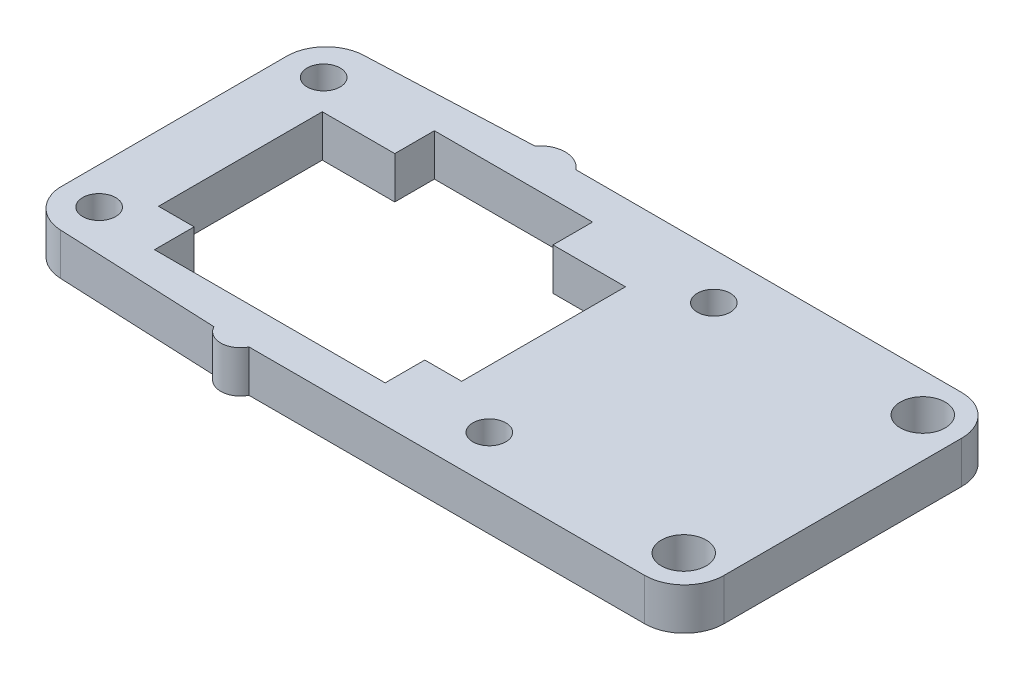
ISO-10303-21;
HEADER;
FILE_DESCRIPTION(('STEP AP214'),'2;1');
FILE_NAME('part.step','',(''),(''),'','','');
FILE_SCHEMA(('AUTOMOTIVE_DESIGN { 1 0 10303 214 1 1 1 1 }'));
ENDSEC;
DATA;
#1=APPLICATION_CONTEXT('core data for automotive mechanical design processes');
#2=APPLICATION_PROTOCOL_DEFINITION('international standard','automotive_design',2000,#1);
#3=PRODUCT_CONTEXT('',#1,'mechanical');
#4=PRODUCT('Part','Part','',(#3));
#5=PRODUCT_RELATED_PRODUCT_CATEGORY('part','',(#4));
#6=PRODUCT_DEFINITION_FORMATION('','',#4);
#7=PRODUCT_DEFINITION_CONTEXT('part definition',#1,'design');
#8=PRODUCT_DEFINITION('design','',#6,#7);
#9=PRODUCT_DEFINITION_SHAPE('','',#8);
#10=(LENGTH_UNIT() NAMED_UNIT(*) SI_UNIT(.MILLI.,.METRE.));
#11=(NAMED_UNIT(*) PLANE_ANGLE_UNIT() SI_UNIT($,.RADIAN.));
#12=(NAMED_UNIT(*) SI_UNIT($,.STERADIAN.) SOLID_ANGLE_UNIT());
#13=UNCERTAINTY_MEASURE_WITH_UNIT(LENGTH_MEASURE(1.E-05),#10,'distance_accuracy_value','');
#14=(GEOMETRIC_REPRESENTATION_CONTEXT(3) GLOBAL_UNCERTAINTY_ASSIGNED_CONTEXT((#13)) GLOBAL_UNIT_ASSIGNED_CONTEXT((#10,
#11,#12)) REPRESENTATION_CONTEXT('',''));
#15=CARTESIAN_POINT('',(0.,0.,0.));
#16=DIRECTION('',(0.,0.,1.));
#17=DIRECTION('',(1.,0.,0.));
#18=AXIS2_PLACEMENT_3D('',#15,#16,#17);
#19=CARTESIAN_POINT('',(3.3843469748906,3.175,1.98427823473681));
#20=DIRECTION('',(0.,1.,0.));
#21=DIRECTION('',(0.,0.,1.));
#22=AXIS2_PLACEMENT_3D('',#19,#20,#21);
#23=PLANE('',#22);
#24=CARTESIAN_POINT('',(34.685233075441,3.175,-0.289707036284531));
#25=DIRECTION('',(0.,1.,0.));
#26=DIRECTION('',(0.,0.,1.));
#27=AXIS2_PLACEMENT_3D('',#24,#25,#26);
#28=CIRCLE('',#27,1.7);
#29=CARTESIAN_POINT('',(34.685233075441,3.175,1.41029296371547));
#30=VERTEX_POINT('',#29);
#31=EDGE_CURVE('E290',#30,#30,#28,.T.);
#32=ORIENTED_EDGE('',*,*,#31,.F.);
#33=EDGE_LOOP('',(#32));
#34=FACE_BOUND('',#33,.T.);
#35=CARTESIAN_POINT('',(19.4122280798133,3.175,-0.839632763997289));
#36=DIRECTION('',(0.,1.,0.));
#37=DIRECTION('',(0.,0.,1.));
#38=AXIS2_PLACEMENT_3D('',#35,#36,#37);
#39=CIRCLE('',#38,1.25);
#40=CARTESIAN_POINT('',(19.4122280798133,3.175,0.410367236002712));
#41=VERTEX_POINT('',#40);
#42=EDGE_CURVE('E302',#41,#41,#39,.T.);
#43=ORIENTED_EDGE('',*,*,#42,.F.);
#44=EDGE_LOOP('',(#43));
#45=FACE_BOUND('',#44,.T.);
#46=CARTESIAN_POINT('',(-10.1352653795593,3.175,-17.8402616182965));
#47=DIRECTION('',(0.,1.,0.));
#48=DIRECTION('',(0.,0.,1.));
#49=AXIS2_PLACEMENT_3D('',#46,#47,#48);
#50=CIRCLE('',#49,1.25);
#51=CARTESIAN_POINT('',(-10.1352653795593,3.175,-16.5902616182965));
#52=VERTEX_POINT('',#51);
#53=EDGE_CURVE('E314',#52,#52,#50,.T.);
#54=ORIENTED_EDGE('',*,*,#53,.F.);
#55=EDGE_LOOP('',(#54));
#56=FACE_BOUND('',#55,.T.);
#57=CARTESIAN_POINT('',(3.3843469748906,3.175,1.98427823473681));
#58=DIRECTION('',(0.,1.,0.));
#59=DIRECTION('',(0.,0.,1.));
#60=AXIS2_PLACEMENT_3D('',#57,#58,#59);
#61=CIRCLE('',#60,1.48732922636627);
#62=CARTESIAN_POINT('',(2.05948744306417,3.175,2.66021865262284));
#63=VERTEX_POINT('',#62);
#64=CARTESIAN_POINT('',(4.70920650665646,3.175,2.66021865274156));
#65=VERTEX_POINT('',#64);
#66=EDGE_CURVE('E320',#63,#65,#61,.T.);
#67=ORIENTED_EDGE('',*,*,#66,.T.);
#68=DIRECTION('',(1.,0.,0.));
#69=VECTOR('',#68,1.);
#70=CARTESIAN_POINT('',(4.70920650665646,3.175,2.66021865274156));
#71=LINE('',#70,#69);
#72=CARTESIAN_POINT('',(34.6801643499563,3.175,2.66021865274156));
#73=VERTEX_POINT('',#72);
#74=EDGE_CURVE('E323',#65,#73,#71,.T.);
#75=ORIENTED_EDGE('',*,*,#74,.T.);
#76=CARTESIAN_POINT('',(34.6801643499563,3.175,-0.339670995738072));
#77=DIRECTION('',(0.,1.,0.));
#78=DIRECTION('',(0.,0.,-1.));
#79=AXIS2_PLACEMENT_3D('',#76,#77,#78);
#80=CIRCLE('',#79,2.99988964847963);
#81=CARTESIAN_POINT('',(37.6800539984359,3.175,-0.339670995738072));
#82=VERTEX_POINT('',#81);
#83=EDGE_CURVE('E326',#73,#82,#80,.T.);
#84=ORIENTED_EDGE('',*,*,#83,.T.);
#85=DIRECTION('',(0.,0.,-1.));
#86=VECTOR('',#85,1.);
#87=CARTESIAN_POINT('',(37.6800539984359,3.175,-0.339670995738072));
#88=LINE('',#87,#86);
#89=CARTESIAN_POINT('',(37.680053998436,3.175,-18.34569235233));
#90=VERTEX_POINT('',#89);
#91=EDGE_CURVE('E328',#82,#90,#88,.T.);
#92=ORIENTED_EDGE('',*,*,#91,.T.);
#93=CARTESIAN_POINT('',(34.6853305618331,3.175,-18.34569235233));
#94=DIRECTION('',(0.,1.,0.));
#95=DIRECTION('',(0.,0.,-1.));
#96=AXIS2_PLACEMENT_3D('',#93,#94,#95);
#97=CIRCLE('',#96,2.99472343660281);
#98=CARTESIAN_POINT('',(34.6853305619677,3.175,-21.3404157889328));
#99=VERTEX_POINT('',#98);
#100=EDGE_CURVE('E330',#90,#99,#97,.T.);
#101=ORIENTED_EDGE('',*,*,#100,.T.);
#102=CARTESIAN_POINT('',(34.6853305619677,3.175,-21.3404157889328));
#103=CARTESIAN_POINT('',(13.555998875761,3.175,-21.3404157898819));
#104=CARTESIAN_POINT('',(5.4575364050089,3.175,-21.3404157902483));
#105=B_SPLINE_CURVE_WITH_KNOTS('',2,(#102,#103,#104),.UNSPECIFIED.,.F.,.F.,(3,3),(8.,9.),.UNSPECIFIED.);
#106=CARTESIAN_POINT('',(5.4575364050089,3.175,-21.3404157902483));
#107=VERTEX_POINT('',#106);
#108=EDGE_CURVE('E332',#99,#107,#105,.T.);
#109=ORIENTED_EDGE('',*,*,#108,.T.);
#110=CARTESIAN_POINT('',(3.90376420784908,3.175,-20.1507548931228));
#111=DIRECTION('',(0.,1.,0.));
#112=DIRECTION('',(0.,0.,-1.));
#113=AXIS2_PLACEMENT_3D('',#110,#111,#112);
#114=CIRCLE('',#113,1.9569111095848);
#115=CARTESIAN_POINT('',(2.34999201079589,3.175,-21.3404157903876));
#116=VERTEX_POINT('',#115);
#117=EDGE_CURVE('E336',#107,#116,#114,.T.);
#118=ORIENTED_EDGE('',*,*,#117,.T.);
#119=DIRECTION('',(-0.999086011528336,0.,0.042745076539896));
#120=VECTOR('',#119,1.);
#121=CARTESIAN_POINT('',(2.34999201079589,3.175,-21.3404157903876));
#122=LINE('',#121,#120);
#123=CARTESIAN_POINT('',(-10.0922641329791,3.175,-20.8080840541229));
#124=VERTEX_POINT('',#123);
#125=EDGE_CURVE('E341',#116,#124,#122,.T.);
#126=ORIENTED_EDGE('',*,*,#125,.T.);
#127=CARTESIAN_POINT('',(-9.96553344927198,3.175,-17.8459919590245));
#128=DIRECTION('',(0.,1.,0.));
#129=DIRECTION('',(0.,0.,1.));
#130=AXIS2_PLACEMENT_3D('',#127,#128,#129);
#131=CIRCLE('',#130,2.96480188984644);
#132=CARTESIAN_POINT('',(-12.9301416772525,3.175,-17.8121053742605));
#133=VERTEX_POINT('',#132);
#134=EDGE_CURVE('E343',#124,#133,#131,.T.);
#135=ORIENTED_EDGE('',*,*,#134,.T.);
#136=DIRECTION('',(0.000812173040055136,0.,0.999999670187422));
#137=VECTOR('',#136,1.);
#138=CARTESIAN_POINT('',(-12.9301416772525,3.175,-17.8121053742605));
#139=LINE('',#138,#137);
#140=CARTESIAN_POINT('',(-12.916142632479,3.175,-0.575581301078846));
#141=VERTEX_POINT('',#140);
#142=EDGE_CURVE('E345',#133,#141,#139,.T.);
#143=ORIENTED_EDGE('',*,*,#142,.T.);
#144=CARTESIAN_POINT('',(-9.9625237252895,3.175,-0.834106409775795));
#145=DIRECTION('',(0.,1.,0.));
#146=DIRECTION('',(0.,0.,-1.));
#147=AXIS2_PLACEMENT_3D('',#144,#145,#146);
#148=CIRCLE('',#147,2.96491144568163);
#149=CARTESIAN_POINT('',(-10.0922641340075,3.175,2.12796504565529));
#150=VERTEX_POINT('',#149);
#151=EDGE_CURVE('E347',#141,#150,#148,.T.);
#152=ORIENTED_EDGE('',*,*,#151,.T.);
#153=DIRECTION('',(0.999042133196024,0.,0.0437586117140054));
#154=VECTOR('',#153,1.);
#155=CARTESIAN_POINT('',(-10.0922641340075,3.175,2.12796504565529));
#156=LINE('',#155,#154);
#157=EDGE_CURVE('E349',#150,#63,#156,.T.);
#158=ORIENTED_EDGE('',*,*,#157,.T.);
#159=EDGE_LOOP('',(#67,#75,#84,#92,#101,#109,#118,#126,#135,#143,#152,#158));
#160=FACE_BOUND('',#159,.T.);
#161=CARTESIAN_POINT('',(-10.1352653803214,3.175,-0.839730428389404));
#162=DIRECTION('',(0.,1.,0.));
#163=DIRECTION('',(0.,0.,1.));
#164=AXIS2_PLACEMENT_3D('',#161,#162,#163);
#165=CIRCLE('',#164,1.25);
#166=CARTESIAN_POINT('',(-10.1352653803214,3.175,0.410269571610595));
#167=VERTEX_POINT('',#166);
#168=EDGE_CURVE('E308',#167,#167,#165,.T.);
#169=ORIENTED_EDGE('',*,*,#168,.F.);
#170=EDGE_LOOP('',(#169));
#171=FACE_BOUND('',#170,.T.);
#172=CARTESIAN_POINT('',(19.4122280805773,3.175,-17.8401688370541));
#173=DIRECTION('',(0.,1.,0.));
#174=DIRECTION('',(0.,0.,1.));
#175=AXIS2_PLACEMENT_3D('',#172,#173,#174);
#176=CIRCLE('',#175,1.25);
#177=CARTESIAN_POINT('',(19.4122280805773,3.175,-16.5901688370541));
#178=VERTEX_POINT('',#177);
#179=EDGE_CURVE('E296',#178,#178,#176,.T.);
#180=ORIENTED_EDGE('',*,*,#179,.F.);
#181=EDGE_LOOP('',(#180));
#182=FACE_BOUND('',#181,.T.);
#183=CARTESIAN_POINT('',(34.6852647593301,3.175,-18.390319188368));
#184=DIRECTION('',(0.,1.,0.));
#185=DIRECTION('',(0.,0.,1.));
#186=AXIS2_PLACEMENT_3D('',#183,#184,#185);
#187=CIRCLE('',#186,1.7);
#188=CARTESIAN_POINT('',(34.6852647593301,3.175,-16.690319188368));
#189=VERTEX_POINT('',#188);
#190=EDGE_CURVE('E284',#189,#189,#187,.T.);
#191=ORIENTED_EDGE('',*,*,#190,.F.);
#192=EDGE_LOOP('',(#191));
#193=FACE_BOUND('',#192,.T.);
#194=DIRECTION('',(-1.,0.,0.));
#195=VECTOR('',#194,1.);
#196=CARTESIAN_POINT('',(9.53011806784337,3.175,-15.540268571059));
#197=LINE('',#196,#195);
#198=CARTESIAN_POINT('',(15.0202005785099,3.175,-15.540268571059));
#199=VERTEX_POINT('',#198);
#200=CARTESIAN_POINT('',(9.53011806784337,3.175,-15.540268571059));
#201=VERTEX_POINT('',#200);
#202=EDGE_CURVE('E210',#199,#201,#197,.T.);
#203=ORIENTED_EDGE('',*,*,#202,.F.);
#204=DIRECTION('',(0.,0.,-1.));
#205=VECTOR('',#204,1.);
#206=CARTESIAN_POINT('',(15.0202005785099,3.175,-15.540268571059));
#207=LINE('',#206,#205);
#208=CARTESIAN_POINT('',(15.0202005785099,3.175,-3.13986020351678));
#209=VERTEX_POINT('',#208);
#210=EDGE_CURVE('E196',#209,#199,#207,.T.);
#211=ORIENTED_EDGE('',*,*,#210,.F.);
#212=DIRECTION('',(1.,0.,0.));
#213=VECTOR('',#212,1.);
#214=CARTESIAN_POINT('',(15.0202005785099,3.175,-3.13986020351678));
#215=LINE('',#214,#213);
#216=CARTESIAN_POINT('',(12.2250708162067,3.175,-3.13986020351678));
#217=VERTEX_POINT('',#216);
#218=EDGE_CURVE('E191',#217,#209,#215,.T.);
#219=ORIENTED_EDGE('',*,*,#218,.F.);
#220=DIRECTION('',(0.,0.,-1.));
#221=VECTOR('',#220,1.);
#222=CARTESIAN_POINT('',(12.2250708162067,3.175,-3.13986020351678));
#223=LINE('',#222,#221);
#224=CARTESIAN_POINT('',(12.2250708162067,3.175,-0.13977967735232));
#225=VERTEX_POINT('',#224);
#226=EDGE_CURVE('E230',#225,#217,#223,.T.);
#227=ORIENTED_EDGE('',*,*,#226,.F.);
#228=DIRECTION('',(1.,0.,0.));
#229=VECTOR('',#228,1.);
#230=CARTESIAN_POINT('',(12.2250708162067,3.175,-0.13977967735232));
#231=LINE('',#230,#229);
#232=CARTESIAN_POINT('',(-5.24381754210346,3.175,-0.13977967735232));
#233=VERTEX_POINT('',#232);
#234=EDGE_CURVE('E228',#233,#225,#231,.T.);
#235=ORIENTED_EDGE('',*,*,#234,.F.);
#236=DIRECTION('',(0.,0.,1.));
#237=VECTOR('',#236,1.);
#238=CARTESIAN_POINT('',(-5.24381754210346,3.175,-0.13977967735232));
#239=LINE('',#238,#237);
#240=CARTESIAN_POINT('',(-5.24381754210346,3.175,-3.13986020351739));
#241=VERTEX_POINT('',#240);
#242=EDGE_CURVE('E226',#241,#233,#239,.T.);
#243=ORIENTED_EDGE('',*,*,#242,.F.);
#244=DIRECTION('',(1.,0.,0.));
#245=VECTOR('',#244,1.);
#246=CARTESIAN_POINT('',(-5.24381754210346,3.175,-3.13986020351739));
#247=LINE('',#246,#245);
#248=CARTESIAN_POINT('',(-7.93896526324439,3.175,-3.13986020351739));
#249=VERTEX_POINT('',#248);
#250=EDGE_CURVE('E224',#249,#241,#247,.T.);
#251=ORIENTED_EDGE('',*,*,#250,.F.);
#252=DIRECTION('',(0.,0.,1.));
#253=VECTOR('',#252,1.);
#254=CARTESIAN_POINT('',(-7.93896526324439,3.175,-3.13986020351739));
#255=LINE('',#254,#253);
#256=CARTESIAN_POINT('',(-7.93896526324439,3.175,-15.5402685710577));
#257=VERTEX_POINT('',#256);
#258=EDGE_CURVE('E222',#257,#249,#255,.T.);
#259=ORIENTED_EDGE('',*,*,#258,.F.);
#260=DIRECTION('',(-1.,0.,0.));
#261=VECTOR('',#260,1.);
#262=CARTESIAN_POINT('',(-7.93896526324439,3.175,-15.5402685710577));
#263=LINE('',#262,#261);
#264=CARTESIAN_POINT('',(-2.4488827525791,3.175,-15.5402685710577));
#265=VERTEX_POINT('',#264);
#266=EDGE_CURVE('E220',#265,#257,#263,.T.);
#267=ORIENTED_EDGE('',*,*,#266,.F.);
#268=DIRECTION('',(0.,0.,1.));
#269=VECTOR('',#268,1.);
#270=CARTESIAN_POINT('',(-2.4488827525791,3.175,-15.5402685710577));
#271=LINE('',#270,#269);
#272=CARTESIAN_POINT('',(-2.4488827525791,3.175,-18.5403490972234));
#273=VERTEX_POINT('',#272);
#274=EDGE_CURVE('E218',#273,#265,#271,.T.);
#275=ORIENTED_EDGE('',*,*,#274,.F.);
#276=DIRECTION('',(-1.,0.,0.));
#277=VECTOR('',#276,1.);
#278=CARTESIAN_POINT('',(-2.4488827525791,3.175,-18.5403490972234));
#279=LINE('',#278,#277);
#280=CARTESIAN_POINT('',(9.53011806784337,3.175,-18.5403490972235));
#281=VERTEX_POINT('',#280);
#282=EDGE_CURVE('E216',#281,#273,#279,.T.);
#283=ORIENTED_EDGE('',*,*,#282,.F.);
#284=DIRECTION('',(0.,0.,-1.));
#285=VECTOR('',#284,1.);
#286=CARTESIAN_POINT('',(9.53011806784337,3.175,-18.5403490972235));
#287=LINE('',#286,#285);
#288=EDGE_CURVE('E212',#201,#281,#287,.T.);
#289=ORIENTED_EDGE('',*,*,#288,.F.);
#290=EDGE_LOOP('',(#203,#211,#219,#227,#235,#243,#251,#259,#267,#275,#283,#289));
#291=FACE_BOUND('',#290,.T.);
#292=ADVANCED_FACE('F33',(#34,#45,#56,#160,#171,#182,#193,#291),#23,.T.);
#293=CARTESIAN_POINT('',(3.3843469748906,0.,1.98427823473681));
#294=DIRECTION('',(0.,1.,0.));
#295=DIRECTION('',(0.,0.,1.));
#296=AXIS2_PLACEMENT_3D('',#293,#294,#295);
#297=PLANE('',#296);
#298=CARTESIAN_POINT('',(34.6852647593301,0.,-18.390319188368));
#299=DIRECTION('',(0.,1.,0.));
#300=DIRECTION('',(0.,0.,1.));
#301=AXIS2_PLACEMENT_3D('',#298,#299,#300);
#302=CIRCLE('',#301,1.7);
#303=CARTESIAN_POINT('',(34.6852647593301,0.,-16.690319188368));
#304=VERTEX_POINT('',#303);
#305=EDGE_CURVE('E205',#304,#304,#302,.T.);
#306=ORIENTED_EDGE('',*,*,#305,.T.);
#307=EDGE_LOOP('',(#306));
#308=FACE_BOUND('',#307,.T.);
#309=CARTESIAN_POINT('',(34.685233075441,0.,-0.289707036284531));
#310=DIRECTION('',(0.,1.,0.));
#311=DIRECTION('',(0.,0.,1.));
#312=AXIS2_PLACEMENT_3D('',#309,#310,#311);
#313=CIRCLE('',#312,1.7);
#314=CARTESIAN_POINT('',(34.685233075441,0.,1.41029296371547));
#315=VERTEX_POINT('',#314);
#316=EDGE_CURVE('E287',#315,#315,#313,.T.);
#317=ORIENTED_EDGE('',*,*,#316,.T.);
#318=EDGE_LOOP('',(#317));
#319=FACE_BOUND('',#318,.T.);
#320=CARTESIAN_POINT('',(19.4122280805773,0.,-17.8401688370541));
#321=DIRECTION('',(0.,1.,0.));
#322=DIRECTION('',(0.,0.,1.));
#323=AXIS2_PLACEMENT_3D('',#320,#321,#322);
#324=CIRCLE('',#323,1.25);
#325=CARTESIAN_POINT('',(19.4122280805773,0.,-16.5901688370541));
#326=VERTEX_POINT('',#325);
#327=EDGE_CURVE('E293',#326,#326,#324,.T.);
#328=ORIENTED_EDGE('',*,*,#327,.T.);
#329=EDGE_LOOP('',(#328));
#330=FACE_BOUND('',#329,.T.);
#331=CARTESIAN_POINT('',(19.4122280798133,0.,-0.839632763997289));
#332=DIRECTION('',(0.,1.,0.));
#333=DIRECTION('',(0.,0.,1.));
#334=AXIS2_PLACEMENT_3D('',#331,#332,#333);
#335=CIRCLE('',#334,1.25);
#336=CARTESIAN_POINT('',(19.4122280798133,0.,0.410367236002712));
#337=VERTEX_POINT('',#336);
#338=EDGE_CURVE('E299',#337,#337,#335,.T.);
#339=ORIENTED_EDGE('',*,*,#338,.T.);
#340=EDGE_LOOP('',(#339));
#341=FACE_BOUND('',#340,.T.);
#342=CARTESIAN_POINT('',(-10.1352653803214,0.,-0.839730428389404));
#343=DIRECTION('',(0.,1.,0.));
#344=DIRECTION('',(0.,0.,1.));
#345=AXIS2_PLACEMENT_3D('',#342,#343,#344);
#346=CIRCLE('',#345,1.25);
#347=CARTESIAN_POINT('',(-10.1352653803214,0.,0.410269571610595));
#348=VERTEX_POINT('',#347);
#349=EDGE_CURVE('E305',#348,#348,#346,.T.);
#350=ORIENTED_EDGE('',*,*,#349,.T.);
#351=EDGE_LOOP('',(#350));
#352=FACE_BOUND('',#351,.T.);
#353=CARTESIAN_POINT('',(-10.1352653795593,0.,-17.8402616182965));
#354=DIRECTION('',(0.,1.,0.));
#355=DIRECTION('',(0.,0.,1.));
#356=AXIS2_PLACEMENT_3D('',#353,#354,#355);
#357=CIRCLE('',#356,1.25);
#358=CARTESIAN_POINT('',(-10.1352653795593,0.,-16.5902616182965));
#359=VERTEX_POINT('',#358);
#360=EDGE_CURVE('E311',#359,#359,#357,.T.);
#361=ORIENTED_EDGE('',*,*,#360,.T.);
#362=EDGE_LOOP('',(#361));
#363=FACE_BOUND('',#362,.T.);
#364=CARTESIAN_POINT('',(3.3843469748906,0.,1.98427823473681));
#365=DIRECTION('',(0.,1.,0.));
#366=DIRECTION('',(0.,0.,1.));
#367=AXIS2_PLACEMENT_3D('',#364,#365,#366);
#368=CIRCLE('',#367,1.48732922636627);
#369=CARTESIAN_POINT('',(2.05948744306417,0.,2.66021865262284));
#370=VERTEX_POINT('',#369);
#371=CARTESIAN_POINT('',(4.70920650665646,0.,2.66021865274156));
#372=VERTEX_POINT('',#371);
#373=EDGE_CURVE('E317',#370,#372,#368,.T.);
#374=ORIENTED_EDGE('',*,*,#373,.F.);
#375=DIRECTION('',(0.999042133196024,0.,0.0437586117140054));
#376=VECTOR('',#375,1.);
#377=CARTESIAN_POINT('',(-10.0922641340075,0.,2.12796504565529));
#378=LINE('',#377,#376);
#379=CARTESIAN_POINT('',(-10.0922641340075,0.,2.12796504565529));
#380=VERTEX_POINT('',#379);
#381=EDGE_CURVE('E324',#380,#370,#378,.T.);
#382=ORIENTED_EDGE('',*,*,#381,.F.);
#383=CARTESIAN_POINT('',(-9.9625237252895,0.,-0.834106409775795));
#384=DIRECTION('',(0.,1.,0.));
#385=DIRECTION('',(0.,0.,-1.));
#386=AXIS2_PLACEMENT_3D('',#383,#384,#385);
#387=CIRCLE('',#386,2.96491144568163);
#388=CARTESIAN_POINT('',(-12.916142632479,0.,-0.575581301078846));
#389=VERTEX_POINT('',#388);
#390=EDGE_CURVE('E377',#389,#380,#387,.T.);
#391=ORIENTED_EDGE('',*,*,#390,.F.);
#392=DIRECTION('',(0.000812173040055136,0.,0.999999670187422));
#393=VECTOR('',#392,1.);
#394=CARTESIAN_POINT('',(-12.9301416772525,0.,-17.8121053742605));
#395=LINE('',#394,#393);
#396=CARTESIAN_POINT('',(-12.9301416772525,0.,-17.8121053742605));
#397=VERTEX_POINT('',#396);
#398=EDGE_CURVE('E375',#397,#389,#395,.T.);
#399=ORIENTED_EDGE('',*,*,#398,.F.);
#400=CARTESIAN_POINT('',(-9.96553344927198,0.,-17.8459919590245));
#401=DIRECTION('',(0.,1.,0.));
#402=DIRECTION('',(0.,0.,1.));
#403=AXIS2_PLACEMENT_3D('',#400,#401,#402);
#404=CIRCLE('',#403,2.96480188984644);
#405=CARTESIAN_POINT('',(-10.0922641329791,0.,-20.8080840541229));
#406=VERTEX_POINT('',#405);
#407=EDGE_CURVE('E373',#406,#397,#404,.T.);
#408=ORIENTED_EDGE('',*,*,#407,.F.);
#409=DIRECTION('',(-0.999086011528336,0.,0.042745076539896));
#410=VECTOR('',#409,1.);
#411=CARTESIAN_POINT('',(2.34999201079589,0.,-21.3404157903876));
#412=LINE('',#411,#410);
#413=CARTESIAN_POINT('',(2.34999201079589,0.,-21.3404157903876));
#414=VERTEX_POINT('',#413);
#415=EDGE_CURVE('E371',#414,#406,#412,.T.);
#416=ORIENTED_EDGE('',*,*,#415,.F.);
#417=CARTESIAN_POINT('',(3.90376420784908,0.,-20.1507548931228));
#418=DIRECTION('',(0.,1.,0.));
#419=DIRECTION('',(0.,0.,-1.));
#420=AXIS2_PLACEMENT_3D('',#417,#418,#419);
#421=CIRCLE('',#420,1.9569111095848);
#422=CARTESIAN_POINT('',(5.4575364050089,0.,-21.3404157902483));
#423=VERTEX_POINT('',#422);
#424=EDGE_CURVE('E366',#423,#414,#421,.T.);
#425=ORIENTED_EDGE('',*,*,#424,.F.);
#426=CARTESIAN_POINT('',(34.6853305619677,0.,-21.3404157889328));
#427=CARTESIAN_POINT('',(13.555998875761,0.,-21.3404157898819));
#428=CARTESIAN_POINT('',(5.4575364050089,0.,-21.3404157902483));
#429=B_SPLINE_CURVE_WITH_KNOTS('',2,(#426,#427,#428),.UNSPECIFIED.,.F.,.F.,(3,3),(8.,9.),.UNSPECIFIED.);
#430=CARTESIAN_POINT('',(34.6853305619677,0.,-21.3404157889328));
#431=VERTEX_POINT('',#430);
#432=EDGE_CURVE('E362',#431,#423,#429,.T.);
#433=ORIENTED_EDGE('',*,*,#432,.F.);
#434=CARTESIAN_POINT('',(34.6853305618331,0.,-18.34569235233));
#435=DIRECTION('',(0.,1.,0.));
#436=DIRECTION('',(0.,0.,-1.));
#437=AXIS2_PLACEMENT_3D('',#434,#435,#436);
#438=CIRCLE('',#437,2.99472343660281);
#439=CARTESIAN_POINT('',(37.680053998436,0.,-18.34569235233));
#440=VERTEX_POINT('',#439);
#441=EDGE_CURVE('E360',#440,#431,#438,.T.);
#442=ORIENTED_EDGE('',*,*,#441,.F.);
#443=DIRECTION('',(0.,0.,-1.));
#444=VECTOR('',#443,1.);
#445=CARTESIAN_POINT('',(37.6800539984359,0.,-0.339670995738072));
#446=LINE('',#445,#444);
#447=CARTESIAN_POINT('',(37.6800539984359,0.,-0.339670995738072));
#448=VERTEX_POINT('',#447);
#449=EDGE_CURVE('E358',#448,#440,#446,.T.);
#450=ORIENTED_EDGE('',*,*,#449,.F.);
#451=CARTESIAN_POINT('',(34.6801643499563,0.,-0.339670995738072));
#452=DIRECTION('',(0.,1.,0.));
#453=DIRECTION('',(0.,0.,-1.));
#454=AXIS2_PLACEMENT_3D('',#451,#452,#453);
#455=CIRCLE('',#454,2.99988964847963);
#456=CARTESIAN_POINT('',(34.6801643499563,0.,2.66021865274156));
#457=VERTEX_POINT('',#456);
#458=EDGE_CURVE('E356',#457,#448,#455,.T.);
#459=ORIENTED_EDGE('',*,*,#458,.F.);
#460=DIRECTION('',(1.,0.,0.));
#461=VECTOR('',#460,1.);
#462=CARTESIAN_POINT('',(4.70920650665646,0.,2.66021865274156));
#463=LINE('',#462,#461);
#464=EDGE_CURVE('E354',#372,#457,#463,.T.);
#465=ORIENTED_EDGE('',*,*,#464,.F.);
#466=EDGE_LOOP('',(#374,#382,#391,#399,#408,#416,#425,#433,#442,#450,#459,#465));
#467=FACE_BOUND('',#466,.T.);
#468=DIRECTION('',(0.,0.,-1.));
#469=VECTOR('',#468,1.);
#470=CARTESIAN_POINT('',(15.0202005785099,0.,-15.540268571059));
#471=LINE('',#470,#469);
#472=CARTESIAN_POINT('',(15.0202005785099,0.,-3.1398602035168));
#473=VERTEX_POINT('',#472);
#474=CARTESIAN_POINT('',(15.0202005785099,0.,-15.540268571059));
#475=VERTEX_POINT('',#474);
#476=EDGE_CURVE('E203',#473,#475,#471,.T.);
#477=ORIENTED_EDGE('',*,*,#476,.T.);
#478=DIRECTION('',(-1.,0.,0.));
#479=VECTOR('',#478,1.);
#480=CARTESIAN_POINT('',(9.53011806784337,0.,-15.540268571059));
#481=LINE('',#480,#479);
#482=CARTESIAN_POINT('',(9.53011806784337,0.,-15.540268571059));
#483=VERTEX_POINT('',#482);
#484=EDGE_CURVE('E233',#475,#483,#481,.T.);
#485=ORIENTED_EDGE('',*,*,#484,.T.);
#486=DIRECTION('',(0.,0.,-1.));
#487=VECTOR('',#486,1.);
#488=CARTESIAN_POINT('',(9.53011806784337,0.,-18.5403490972235));
#489=LINE('',#488,#487);
#490=CARTESIAN_POINT('',(9.53011806784337,0.,-18.5403490972235));
#491=VERTEX_POINT('',#490);
#492=EDGE_CURVE('E236',#483,#491,#489,.T.);
#493=ORIENTED_EDGE('',*,*,#492,.T.);
#494=DIRECTION('',(-1.,0.,0.));
#495=VECTOR('',#494,1.);
#496=CARTESIAN_POINT('',(-2.4488827525791,0.,-18.5403490972234));
#497=LINE('',#496,#495);
#498=CARTESIAN_POINT('',(-2.4488827525791,0.,-18.5403490972234));
#499=VERTEX_POINT('',#498);
#500=EDGE_CURVE('E239',#491,#499,#497,.T.);
#501=ORIENTED_EDGE('',*,*,#500,.T.);
#502=DIRECTION('',(0.,0.,1.));
#503=VECTOR('',#502,1.);
#504=CARTESIAN_POINT('',(-2.4488827525791,0.,-15.5402685710577));
#505=LINE('',#504,#503);
#506=CARTESIAN_POINT('',(-2.4488827525791,0.,-15.5402685710577));
#507=VERTEX_POINT('',#506);
#508=EDGE_CURVE('E242',#499,#507,#505,.T.);
#509=ORIENTED_EDGE('',*,*,#508,.T.);
#510=DIRECTION('',(-1.,0.,0.));
#511=VECTOR('',#510,1.);
#512=CARTESIAN_POINT('',(-7.93896526324439,0.,-15.5402685710577));
#513=LINE('',#512,#511);
#514=CARTESIAN_POINT('',(-7.93896526324439,0.,-15.5402685710577));
#515=VERTEX_POINT('',#514);
#516=EDGE_CURVE('E245',#507,#515,#513,.T.);
#517=ORIENTED_EDGE('',*,*,#516,.T.);
#518=DIRECTION('',(0.,0.,1.));
#519=VECTOR('',#518,1.);
#520=CARTESIAN_POINT('',(-7.93896526324439,0.,-3.13986020351739));
#521=LINE('',#520,#519);
#522=CARTESIAN_POINT('',(-7.93896526324439,0.,-3.13986020351739));
#523=VERTEX_POINT('',#522);
#524=EDGE_CURVE('E248',#515,#523,#521,.T.);
#525=ORIENTED_EDGE('',*,*,#524,.T.);
#526=DIRECTION('',(1.,0.,0.));
#527=VECTOR('',#526,1.);
#528=CARTESIAN_POINT('',(-5.24381754210346,0.,-3.13986020351739));
#529=LINE('',#528,#527);
#530=CARTESIAN_POINT('',(-5.24381754210346,0.,-3.13986020351739));
#531=VERTEX_POINT('',#530);
#532=EDGE_CURVE('E251',#523,#531,#529,.T.);
#533=ORIENTED_EDGE('',*,*,#532,.T.);
#534=DIRECTION('',(0.,0.,1.));
#535=VECTOR('',#534,1.);
#536=CARTESIAN_POINT('',(-5.24381754210346,0.,-0.13977967735232));
#537=LINE('',#536,#535);
#538=CARTESIAN_POINT('',(-5.24381754210346,0.,-0.13977967735232));
#539=VERTEX_POINT('',#538);
#540=EDGE_CURVE('E254',#531,#539,#537,.T.);
#541=ORIENTED_EDGE('',*,*,#540,.T.);
#542=DIRECTION('',(1.,0.,0.));
#543=VECTOR('',#542,1.);
#544=CARTESIAN_POINT('',(12.2250708162067,0.,-0.13977967735232));
#545=LINE('',#544,#543);
#546=CARTESIAN_POINT('',(12.2250708162067,0.,-0.13977967735232));
#547=VERTEX_POINT('',#546);
#548=EDGE_CURVE('E257',#539,#547,#545,.T.);
#549=ORIENTED_EDGE('',*,*,#548,.T.);
#550=DIRECTION('',(0.,0.,-1.));
#551=VECTOR('',#550,1.);
#552=CARTESIAN_POINT('',(12.2250708162067,0.,-3.13986020351678));
#553=LINE('',#552,#551);
#554=CARTESIAN_POINT('',(12.2250708162067,0.,-3.13986020351678));
#555=VERTEX_POINT('',#554);
#556=EDGE_CURVE('E260',#547,#555,#553,.T.);
#557=ORIENTED_EDGE('',*,*,#556,.T.);
#558=DIRECTION('',(1.,0.,0.));
#559=VECTOR('',#558,1.);
#560=CARTESIAN_POINT('',(12.2750959570235,0.,-3.13986020351678));
#561=LINE('',#560,#559);
#562=EDGE_CURVE('E197',#555,#473,#561,.T.);
#563=ORIENTED_EDGE('',*,*,#562,.T.);
#564=EDGE_LOOP('',(#477,#485,#493,#501,#509,#517,#525,#533,#541,#549,#557,#563));
#565=FACE_BOUND('',#564,.T.);
#566=ADVANCED_FACE('F419',(#308,#319,#330,#341,#352,#363,#467,#565),#297,.F.);
#567=CARTESIAN_POINT('',(3.3843469748906,3.175,1.98427823473681));
#568=DIRECTION('',(0.,-1.,0.));
#569=DIRECTION('',(0.,0.,-1.));
#570=AXIS2_PLACEMENT_3D('',#567,#568,#569);
#571=CYLINDRICAL_SURFACE('',#570,1.48732922636627);
#572=ORIENTED_EDGE('',*,*,#373,.T.);
#573=DIRECTION('',(0.,-1.,0.));
#574=VECTOR('',#573,1.);
#575=CARTESIAN_POINT('',(4.70920650665646,3.175,2.66021865274156));
#576=LINE('',#575,#574);
#577=EDGE_CURVE('E11',#65,#372,#576,.T.);
#578=ORIENTED_EDGE('',*,*,#577,.F.);
#579=ORIENTED_EDGE('',*,*,#66,.F.);
#580=DIRECTION('',(0.,-1.,0.));
#581=VECTOR('',#580,1.);
#582=CARTESIAN_POINT('',(2.05948744306417,3.175,2.66021865262284));
#583=LINE('',#582,#581);
#584=EDGE_CURVE('E351',#63,#370,#583,.T.);
#585=ORIENTED_EDGE('',*,*,#584,.T.);
#586=EDGE_LOOP('',(#572,#578,#579,#585));
#587=FACE_BOUND('',#586,.T.);
#588=ADVANCED_FACE('F35',(#587),#571,.T.);
#589=CARTESIAN_POINT('',(4.70920650665646,3.175,2.66021865274156));
#590=DIRECTION('',(0.,0.,-1.));
#591=DIRECTION('',(-1.,0.,0.));
#592=AXIS2_PLACEMENT_3D('',#589,#590,#591);
#593=PLANE('',#592);
#594=ORIENTED_EDGE('',*,*,#464,.T.);
#595=DIRECTION('',(0.,-1.,0.));
#596=VECTOR('',#595,1.);
#597=CARTESIAN_POINT('',(34.6801643499563,3.175,2.66021865274156));
#598=LINE('',#597,#596);
#599=EDGE_CURVE('E41',#73,#457,#598,.T.);
#600=ORIENTED_EDGE('',*,*,#599,.F.);
#601=ORIENTED_EDGE('',*,*,#74,.F.);
#602=ORIENTED_EDGE('',*,*,#577,.T.);
#603=EDGE_LOOP('',(#594,#600,#601,#602));
#604=FACE_BOUND('',#603,.T.);
#605=ADVANCED_FACE('F437',(#604),#593,.F.);
#606=CARTESIAN_POINT('',(34.6801643499563,3.175,-0.339670995738072));
#607=DIRECTION('',(0.,-1.,0.));
#608=DIRECTION('',(0.,0.,-1.));
#609=AXIS2_PLACEMENT_3D('',#606,#607,#608);
#610=CYLINDRICAL_SURFACE('',#609,2.99988964847963);
#611=ORIENTED_EDGE('',*,*,#458,.T.);
#612=DIRECTION('',(0.,-1.,0.));
#613=VECTOR('',#612,1.);
#614=CARTESIAN_POINT('',(37.6800539984359,3.175,-0.339670995738072));
#615=LINE('',#614,#613);
#616=EDGE_CURVE('E406',#82,#448,#615,.T.);
#617=ORIENTED_EDGE('',*,*,#616,.F.);
#618=ORIENTED_EDGE('',*,*,#83,.F.);
#619=ORIENTED_EDGE('',*,*,#599,.T.);
#620=EDGE_LOOP('',(#611,#617,#618,#619));
#621=FACE_BOUND('',#620,.T.);
#622=ADVANCED_FACE('F413',(#621),#610,.T.);
#623=CARTESIAN_POINT('',(37.6800539984359,3.175,-0.339670995738072));
#624=DIRECTION('',(-1.,0.,0.));
#625=DIRECTION('',(0.,0.,1.));
#626=AXIS2_PLACEMENT_3D('',#623,#624,#625);
#627=PLANE('',#626);
#628=ORIENTED_EDGE('',*,*,#449,.T.);
#629=DIRECTION('',(0.,-1.,0.));
#630=VECTOR('',#629,1.);
#631=CARTESIAN_POINT('',(37.680053998436,3.175,-18.34569235233));
#632=LINE('',#631,#630);
#633=EDGE_CURVE('E403',#90,#440,#632,.T.);
#634=ORIENTED_EDGE('',*,*,#633,.F.);
#635=ORIENTED_EDGE('',*,*,#91,.F.);
#636=ORIENTED_EDGE('',*,*,#616,.T.);
#637=EDGE_LOOP('',(#628,#634,#635,#636));
#638=FACE_BOUND('',#637,.T.);
#639=ADVANCED_FACE('F425',(#638),#627,.F.);
#640=CARTESIAN_POINT('',(34.6853305618331,3.175,-18.34569235233));
#641=DIRECTION('',(0.,-1.,0.));
#642=DIRECTION('',(0.,0.,-1.));
#643=AXIS2_PLACEMENT_3D('',#640,#641,#642);
#644=CYLINDRICAL_SURFACE('',#643,2.99472343660281);
#645=ORIENTED_EDGE('',*,*,#441,.T.);
#646=DIRECTION('',(0.,-1.,0.));
#647=VECTOR('',#646,1.);
#648=CARTESIAN_POINT('',(34.6853305619677,3.175,-21.3404157889328));
#649=LINE('',#648,#647);
#650=EDGE_CURVE('E400',#99,#431,#649,.T.);
#651=ORIENTED_EDGE('',*,*,#650,.F.);
#652=ORIENTED_EDGE('',*,*,#100,.F.);
#653=ORIENTED_EDGE('',*,*,#633,.T.);
#654=EDGE_LOOP('',(#645,#651,#652,#653));
#655=FACE_BOUND('',#654,.T.);
#656=ADVANCED_FACE('F429',(#655),#644,.T.);
#657=CARTESIAN_POINT('',(34.6853305619677,3.175,-21.3404157889328));
#658=DIRECTION('',(-4.50081650714424E-11,0.,1.));
#659=DIRECTION('',(1.,0.,4.50081650714424E-11));
#660=AXIS2_PLACEMENT_3D('',#657,#658,#659);
#661=PLANE('',#660);
#662=ORIENTED_EDGE('',*,*,#432,.T.);
#663=DIRECTION('',(0.,-1.,0.));
#664=VECTOR('',#663,1.);
#665=CARTESIAN_POINT('',(5.4575364050089,3.175,-21.3404157902483));
#666=LINE('',#665,#664);
#667=EDGE_CURVE('E397',#107,#423,#666,.T.);
#668=ORIENTED_EDGE('',*,*,#667,.F.);
#669=ORIENTED_EDGE('',*,*,#108,.F.);
#670=ORIENTED_EDGE('',*,*,#650,.T.);
#671=EDGE_LOOP('',(#662,#668,#669,#670));
#672=FACE_BOUND('',#671,.T.);
#673=ADVANCED_FACE('F470',(#672),#661,.F.);
#674=CARTESIAN_POINT('',(3.90376420784908,3.175,-20.1507548931228));
#675=DIRECTION('',(0.,-1.,0.));
#676=DIRECTION('',(0.,0.,-1.));
#677=AXIS2_PLACEMENT_3D('',#674,#675,#676);
#678=CYLINDRICAL_SURFACE('',#677,1.9569111095848);
#679=ORIENTED_EDGE('',*,*,#424,.T.);
#680=DIRECTION('',(0.,-1.,0.));
#681=VECTOR('',#680,1.);
#682=CARTESIAN_POINT('',(2.34999201079589,3.175,-21.3404157903876));
#683=LINE('',#682,#681);
#684=EDGE_CURVE('E394',#116,#414,#683,.T.);
#685=ORIENTED_EDGE('',*,*,#684,.F.);
#686=ORIENTED_EDGE('',*,*,#117,.F.);
#687=ORIENTED_EDGE('',*,*,#667,.T.);
#688=EDGE_LOOP('',(#679,#685,#686,#687));
#689=FACE_BOUND('',#688,.T.);
#690=ADVANCED_FACE('F468',(#689),#678,.T.);
#691=CARTESIAN_POINT('',(2.34999201079589,3.175,-21.3404157903876));
#692=DIRECTION('',(0.042745076539896,0.,0.999086011528336));
#693=DIRECTION('',(0.999086011528336,0.,-0.042745076539896));
#694=AXIS2_PLACEMENT_3D('',#691,#692,#693);
#695=PLANE('',#694);
#696=ORIENTED_EDGE('',*,*,#415,.T.);
#697=DIRECTION('',(0.,-1.,0.));
#698=VECTOR('',#697,1.);
#699=CARTESIAN_POINT('',(-10.0922641329791,3.175,-20.8080840541229));
#700=LINE('',#699,#698);
#701=EDGE_CURVE('E391',#124,#406,#700,.T.);
#702=ORIENTED_EDGE('',*,*,#701,.F.);
#703=ORIENTED_EDGE('',*,*,#125,.F.);
#704=ORIENTED_EDGE('',*,*,#684,.T.);
#705=EDGE_LOOP('',(#696,#702,#703,#704));
#706=FACE_BOUND('',#705,.T.);
#707=ADVANCED_FACE('F464',(#706),#695,.F.);
#708=CARTESIAN_POINT('',(-9.96553344927198,3.175,-17.8459919590245));
#709=DIRECTION('',(0.,-1.,0.));
#710=DIRECTION('',(0.,0.,-1.));
#711=AXIS2_PLACEMENT_3D('',#708,#709,#710);
#712=CYLINDRICAL_SURFACE('',#711,2.96480188984644);
#713=ORIENTED_EDGE('',*,*,#407,.T.);
#714=DIRECTION('',(0.,-1.,0.));
#715=VECTOR('',#714,1.);
#716=CARTESIAN_POINT('',(-12.9301416772525,3.175,-17.8121053742605));
#717=LINE('',#716,#715);
#718=EDGE_CURVE('E388',#133,#397,#717,.T.);
#719=ORIENTED_EDGE('',*,*,#718,.F.);
#720=ORIENTED_EDGE('',*,*,#134,.F.);
#721=ORIENTED_EDGE('',*,*,#701,.T.);
#722=EDGE_LOOP('',(#713,#719,#720,#721));
#723=FACE_BOUND('',#722,.T.);
#724=ADVANCED_FACE('F459',(#723),#712,.T.);
#725=CARTESIAN_POINT('',(-12.9301416772525,3.175,-17.8121053742605));
#726=DIRECTION('',(0.999999670187422,0.,-0.000812173040055136));
#727=DIRECTION('',(-0.000812173040055136,0.,-0.999999670187422));
#728=AXIS2_PLACEMENT_3D('',#725,#726,#727);
#729=PLANE('',#728);
#730=ORIENTED_EDGE('',*,*,#398,.T.);
#731=DIRECTION('',(0.,-1.,0.));
#732=VECTOR('',#731,1.);
#733=CARTESIAN_POINT('',(-12.916142632479,3.175,-0.575581301078846));
#734=LINE('',#733,#732);
#735=EDGE_CURVE('E385',#141,#389,#734,.T.);
#736=ORIENTED_EDGE('',*,*,#735,.F.);
#737=ORIENTED_EDGE('',*,*,#142,.F.);
#738=ORIENTED_EDGE('',*,*,#718,.T.);
#739=EDGE_LOOP('',(#730,#736,#737,#738));
#740=FACE_BOUND('',#739,.T.);
#741=ADVANCED_FACE('F453',(#740),#729,.F.);
#742=CARTESIAN_POINT('',(-9.9625237252895,3.175,-0.834106409775795));
#743=DIRECTION('',(0.,-1.,0.));
#744=DIRECTION('',(0.,0.,-1.));
#745=AXIS2_PLACEMENT_3D('',#742,#743,#744);
#746=CYLINDRICAL_SURFACE('',#745,2.96491144568163);
#747=ORIENTED_EDGE('',*,*,#390,.T.);
#748=DIRECTION('',(0.,-1.,0.));
#749=VECTOR('',#748,1.);
#750=CARTESIAN_POINT('',(-10.0922641340075,3.175,2.12796504565529));
#751=LINE('',#750,#749);
#752=EDGE_CURVE('E382',#150,#380,#751,.T.);
#753=ORIENTED_EDGE('',*,*,#752,.F.);
#754=ORIENTED_EDGE('',*,*,#151,.F.);
#755=ORIENTED_EDGE('',*,*,#735,.T.);
#756=EDGE_LOOP('',(#747,#753,#754,#755));
#757=FACE_BOUND('',#756,.T.);
#758=ADVANCED_FACE('F449',(#757),#746,.T.);
#759=CARTESIAN_POINT('',(-10.0922641340075,3.175,2.12796504565529));
#760=DIRECTION('',(0.0437586117140054,0.,-0.999042133196024));
#761=DIRECTION('',(-0.999042133196025,0.,-0.0437586117140054));
#762=AXIS2_PLACEMENT_3D('',#759,#760,#761);
#763=PLANE('',#762);
#764=ORIENTED_EDGE('',*,*,#381,.T.);
#765=ORIENTED_EDGE('',*,*,#584,.F.);
#766=ORIENTED_EDGE('',*,*,#157,.F.);
#767=ORIENTED_EDGE('',*,*,#752,.T.);
#768=EDGE_LOOP('',(#764,#765,#766,#767));
#769=FACE_BOUND('',#768,.T.);
#770=ADVANCED_FACE('F444',(#769),#763,.F.);
#771=CARTESIAN_POINT('',(-10.1352653795593,3.175,-17.8402616182965));
#772=DIRECTION('',(0.,-1.,0.));
#773=DIRECTION('',(0.,0.,-1.));
#774=AXIS2_PLACEMENT_3D('',#771,#772,#773);
#775=CYLINDRICAL_SURFACE('',#774,1.25);
#776=ORIENTED_EDGE('',*,*,#53,.T.);
#777=EDGE_LOOP('',(#776));
#778=FACE_BOUND('',#777,.T.);
#779=ORIENTED_EDGE('',*,*,#360,.F.);
#780=EDGE_LOOP('',(#779));
#781=FACE_BOUND('',#780,.T.);
#782=ADVANCED_FACE('F490',(#778,#781),#775,.F.);
#783=CARTESIAN_POINT('',(-10.1352653803214,3.175,-0.839730428389404));
#784=DIRECTION('',(0.,-1.,0.));
#785=DIRECTION('',(0.,0.,-1.));
#786=AXIS2_PLACEMENT_3D('',#783,#784,#785);
#787=CYLINDRICAL_SURFACE('',#786,1.25);
#788=ORIENTED_EDGE('',*,*,#168,.T.);
#789=EDGE_LOOP('',(#788));
#790=FACE_BOUND('',#789,.T.);
#791=ORIENTED_EDGE('',*,*,#349,.F.);
#792=EDGE_LOOP('',(#791));
#793=FACE_BOUND('',#792,.T.);
#794=ADVANCED_FACE('F528',(#790,#793),#787,.F.);
#795=CARTESIAN_POINT('',(19.4122280798133,3.175,-0.839632763997289));
#796=DIRECTION('',(0.,-1.,0.));
#797=DIRECTION('',(0.,0.,-1.));
#798=AXIS2_PLACEMENT_3D('',#795,#796,#797);
#799=CYLINDRICAL_SURFACE('',#798,1.25);
#800=ORIENTED_EDGE('',*,*,#42,.T.);
#801=EDGE_LOOP('',(#800));
#802=FACE_BOUND('',#801,.T.);
#803=ORIENTED_EDGE('',*,*,#338,.F.);
#804=EDGE_LOOP('',(#803));
#805=FACE_BOUND('',#804,.T.);
#806=ADVANCED_FACE('F535',(#802,#805),#799,.F.);
#807=CARTESIAN_POINT('',(19.4122280805773,3.175,-17.8401688370541));
#808=DIRECTION('',(0.,-1.,0.));
#809=DIRECTION('',(0.,0.,-1.));
#810=AXIS2_PLACEMENT_3D('',#807,#808,#809);
#811=CYLINDRICAL_SURFACE('',#810,1.25);
#812=ORIENTED_EDGE('',*,*,#179,.T.);
#813=EDGE_LOOP('',(#812));
#814=FACE_BOUND('',#813,.T.);
#815=ORIENTED_EDGE('',*,*,#327,.F.);
#816=EDGE_LOOP('',(#815));
#817=FACE_BOUND('',#816,.T.);
#818=ADVANCED_FACE('F542',(#814,#817),#811,.F.);
#819=CARTESIAN_POINT('',(34.685233075441,3.175,-0.289707036284531));
#820=DIRECTION('',(0.,-1.,0.));
#821=DIRECTION('',(0.,0.,-1.));
#822=AXIS2_PLACEMENT_3D('',#819,#820,#821);
#823=CYLINDRICAL_SURFACE('',#822,1.7);
#824=ORIENTED_EDGE('',*,*,#31,.T.);
#825=EDGE_LOOP('',(#824));
#826=FACE_BOUND('',#825,.T.);
#827=ORIENTED_EDGE('',*,*,#316,.F.);
#828=EDGE_LOOP('',(#827));
#829=FACE_BOUND('',#828,.T.);
#830=ADVANCED_FACE('F550',(#826,#829),#823,.F.);
#831=CARTESIAN_POINT('',(34.6852647593301,3.175,-18.390319188368));
#832=DIRECTION('',(0.,-1.,0.));
#833=DIRECTION('',(0.,0.,-1.));
#834=AXIS2_PLACEMENT_3D('',#831,#832,#833);
#835=CYLINDRICAL_SURFACE('',#834,1.7);
#836=ORIENTED_EDGE('',*,*,#190,.T.);
#837=EDGE_LOOP('',(#836));
#838=FACE_BOUND('',#837,.T.);
#839=ORIENTED_EDGE('',*,*,#305,.F.);
#840=EDGE_LOOP('',(#839));
#841=FACE_BOUND('',#840,.T.);
#842=ADVANCED_FACE('F558',(#838,#841),#835,.F.);
#843=CARTESIAN_POINT('',(15.0202005785099,3.175,-15.540268571059));
#844=DIRECTION('',(-1.,0.,0.));
#845=DIRECTION('',(0.,0.,1.));
#846=AXIS2_PLACEMENT_3D('',#843,#844,#845);
#847=PLANE('',#846);
#848=ORIENTED_EDGE('',*,*,#476,.F.);
#849=DIRECTION('',(0.,-1.,0.));
#850=VECTOR('',#849,1.);
#851=CARTESIAN_POINT('',(15.0202005785099,3.175,-3.13986020351678));
#852=LINE('',#851,#850);
#853=EDGE_CURVE('E53',#209,#473,#852,.T.);
#854=ORIENTED_EDGE('',*,*,#853,.F.);
#855=ORIENTED_EDGE('',*,*,#210,.T.);
#856=DIRECTION('',(0.,-1.,0.));
#857=VECTOR('',#856,1.);
#858=CARTESIAN_POINT('',(15.0202005785099,3.175,-15.540268571059));
#859=LINE('',#858,#857);
#860=EDGE_CURVE('E206',#199,#475,#859,.T.);
#861=ORIENTED_EDGE('',*,*,#860,.T.);
#862=EDGE_LOOP('',(#848,#854,#855,#861));
#863=FACE_BOUND('',#862,.T.);
#864=ADVANCED_FACE('F200',(#863),#847,.T.);
#865=CARTESIAN_POINT('',(9.53011806784337,3.175,-15.540268571059));
#866=DIRECTION('',(0.,0.,1.));
#867=DIRECTION('',(1.,0.,0.));
#868=AXIS2_PLACEMENT_3D('',#865,#866,#867);
#869=PLANE('',#868);
#870=ORIENTED_EDGE('',*,*,#484,.F.);
#871=ORIENTED_EDGE('',*,*,#860,.F.);
#872=ORIENTED_EDGE('',*,*,#202,.T.);
#873=DIRECTION('',(0.,-1.,0.));
#874=VECTOR('',#873,1.);
#875=CARTESIAN_POINT('',(9.53011806784337,3.175,-15.540268571059));
#876=LINE('',#875,#874);
#877=EDGE_CURVE('E281',#201,#483,#876,.T.);
#878=ORIENTED_EDGE('',*,*,#877,.T.);
#879=EDGE_LOOP('',(#870,#871,#872,#878));
#880=FACE_BOUND('',#879,.T.);
#881=ADVANCED_FACE('F573',(#880),#869,.T.);
#882=CARTESIAN_POINT('',(9.53011806784337,3.175,-18.5403490972235));
#883=DIRECTION('',(-1.,0.,0.));
#884=DIRECTION('',(0.,0.,1.));
#885=AXIS2_PLACEMENT_3D('',#882,#883,#884);
#886=PLANE('',#885);
#887=ORIENTED_EDGE('',*,*,#492,.F.);
#888=ORIENTED_EDGE('',*,*,#877,.F.);
#889=ORIENTED_EDGE('',*,*,#288,.T.);
#890=DIRECTION('',(0.,-1.,0.));
#891=VECTOR('',#890,1.);
#892=CARTESIAN_POINT('',(9.53011806784337,3.175,-18.5403490972235));
#893=LINE('',#892,#891);
#894=EDGE_CURVE('E279',#281,#491,#893,.T.);
#895=ORIENTED_EDGE('',*,*,#894,.T.);
#896=EDGE_LOOP('',(#887,#888,#889,#895));
#897=FACE_BOUND('',#896,.T.);
#898=ADVANCED_FACE('F580',(#897),#886,.T.);
#899=CARTESIAN_POINT('',(-2.4488827525791,3.175,-18.5403490972234));
#900=DIRECTION('',(0.,0.,1.));
#901=DIRECTION('',(1.,0.,0.));
#902=AXIS2_PLACEMENT_3D('',#899,#900,#901);
#903=PLANE('',#902);
#904=ORIENTED_EDGE('',*,*,#500,.F.);
#905=ORIENTED_EDGE('',*,*,#894,.F.);
#906=ORIENTED_EDGE('',*,*,#282,.T.);
#907=DIRECTION('',(0.,-1.,0.));
#908=VECTOR('',#907,1.);
#909=CARTESIAN_POINT('',(-2.4488827525791,3.175,-18.5403490972234));
#910=LINE('',#909,#908);
#911=EDGE_CURVE('E277',#273,#499,#910,.T.);
#912=ORIENTED_EDGE('',*,*,#911,.T.);
#913=EDGE_LOOP('',(#904,#905,#906,#912));
#914=FACE_BOUND('',#913,.T.);
#915=ADVANCED_FACE('F588',(#914),#903,.T.);
#916=CARTESIAN_POINT('',(-2.4488827525791,3.175,-15.5402685710577));
#917=DIRECTION('',(1.,0.,0.));
#918=DIRECTION('',(0.,0.,-1.));
#919=AXIS2_PLACEMENT_3D('',#916,#917,#918);
#920=PLANE('',#919);
#921=ORIENTED_EDGE('',*,*,#508,.F.);
#922=ORIENTED_EDGE('',*,*,#911,.F.);
#923=ORIENTED_EDGE('',*,*,#274,.T.);
#924=DIRECTION('',(0.,-1.,0.));
#925=VECTOR('',#924,1.);
#926=CARTESIAN_POINT('',(-2.4488827525791,3.175,-15.5402685710577));
#927=LINE('',#926,#925);
#928=EDGE_CURVE('E275',#265,#507,#927,.T.);
#929=ORIENTED_EDGE('',*,*,#928,.T.);
#930=EDGE_LOOP('',(#921,#922,#923,#929));
#931=FACE_BOUND('',#930,.T.);
#932=ADVANCED_FACE('F596',(#931),#920,.T.);
#933=CARTESIAN_POINT('',(-7.93896526324439,3.175,-15.5402685710577));
#934=DIRECTION('',(0.,0.,1.));
#935=DIRECTION('',(1.,0.,0.));
#936=AXIS2_PLACEMENT_3D('',#933,#934,#935);
#937=PLANE('',#936);
#938=ORIENTED_EDGE('',*,*,#516,.F.);
#939=ORIENTED_EDGE('',*,*,#928,.F.);
#940=ORIENTED_EDGE('',*,*,#266,.T.);
#941=DIRECTION('',(0.,-1.,0.));
#942=VECTOR('',#941,1.);
#943=CARTESIAN_POINT('',(-7.93896526324439,3.175,-15.5402685710577));
#944=LINE('',#943,#942);
#945=EDGE_CURVE('E273',#257,#515,#944,.T.);
#946=ORIENTED_EDGE('',*,*,#945,.T.);
#947=EDGE_LOOP('',(#938,#939,#940,#946));
#948=FACE_BOUND('',#947,.T.);
#949=ADVANCED_FACE('F604',(#948),#937,.T.);
#950=CARTESIAN_POINT('',(-7.93896526324439,3.175,-3.13986020351739));
#951=DIRECTION('',(1.,0.,0.));
#952=DIRECTION('',(0.,0.,-1.));
#953=AXIS2_PLACEMENT_3D('',#950,#951,#952);
#954=PLANE('',#953);
#955=ORIENTED_EDGE('',*,*,#524,.F.);
#956=ORIENTED_EDGE('',*,*,#945,.F.);
#957=ORIENTED_EDGE('',*,*,#258,.T.);
#958=DIRECTION('',(0.,-1.,0.));
#959=VECTOR('',#958,1.);
#960=CARTESIAN_POINT('',(-7.93896526324439,3.175,-3.13986020351739));
#961=LINE('',#960,#959);
#962=EDGE_CURVE('E271',#249,#523,#961,.T.);
#963=ORIENTED_EDGE('',*,*,#962,.T.);
#964=EDGE_LOOP('',(#955,#956,#957,#963));
#965=FACE_BOUND('',#964,.T.);
#966=ADVANCED_FACE('F612',(#965),#954,.T.);
#967=CARTESIAN_POINT('',(-5.24381754210346,3.175,-3.13986020351739));
#968=DIRECTION('',(0.,0.,-1.));
#969=DIRECTION('',(-1.,0.,0.));
#970=AXIS2_PLACEMENT_3D('',#967,#968,#969);
#971=PLANE('',#970);
#972=ORIENTED_EDGE('',*,*,#532,.F.);
#973=ORIENTED_EDGE('',*,*,#962,.F.);
#974=ORIENTED_EDGE('',*,*,#250,.T.);
#975=DIRECTION('',(0.,-1.,0.));
#976=VECTOR('',#975,1.);
#977=CARTESIAN_POINT('',(-5.24381754210346,3.175,-3.13986020351739));
#978=LINE('',#977,#976);
#979=EDGE_CURVE('E269',#241,#531,#978,.T.);
#980=ORIENTED_EDGE('',*,*,#979,.T.);
#981=EDGE_LOOP('',(#972,#973,#974,#980));
#982=FACE_BOUND('',#981,.T.);
#983=ADVANCED_FACE('F620',(#982),#971,.T.);
#984=CARTESIAN_POINT('',(-5.24381754210346,3.175,-0.13977967735232));
#985=DIRECTION('',(1.,0.,0.));
#986=DIRECTION('',(0.,0.,-1.));
#987=AXIS2_PLACEMENT_3D('',#984,#985,#986);
#988=PLANE('',#987);
#989=ORIENTED_EDGE('',*,*,#540,.F.);
#990=ORIENTED_EDGE('',*,*,#979,.F.);
#991=ORIENTED_EDGE('',*,*,#242,.T.);
#992=DIRECTION('',(0.,-1.,0.));
#993=VECTOR('',#992,1.);
#994=CARTESIAN_POINT('',(-5.24381754210346,3.175,-0.13977967735232));
#995=LINE('',#994,#993);
#996=EDGE_CURVE('E267',#233,#539,#995,.T.);
#997=ORIENTED_EDGE('',*,*,#996,.T.);
#998=EDGE_LOOP('',(#989,#990,#991,#997));
#999=FACE_BOUND('',#998,.T.);
#1000=ADVANCED_FACE('F628',(#999),#988,.T.);
#1001=CARTESIAN_POINT('',(12.2250708162067,3.175,-0.13977967735232));
#1002=DIRECTION('',(0.,0.,-1.));
#1003=DIRECTION('',(-1.,0.,0.));
#1004=AXIS2_PLACEMENT_3D('',#1001,#1002,#1003);
#1005=PLANE('',#1004);
#1006=ORIENTED_EDGE('',*,*,#548,.F.);
#1007=ORIENTED_EDGE('',*,*,#996,.F.);
#1008=ORIENTED_EDGE('',*,*,#234,.T.);
#1009=DIRECTION('',(0.,-1.,0.));
#1010=VECTOR('',#1009,1.);
#1011=CARTESIAN_POINT('',(12.2250708162067,3.175,-0.13977967735232));
#1012=LINE('',#1011,#1010);
#1013=EDGE_CURVE('E265',#225,#547,#1012,.T.);
#1014=ORIENTED_EDGE('',*,*,#1013,.T.);
#1015=EDGE_LOOP('',(#1006,#1007,#1008,#1014));
#1016=FACE_BOUND('',#1015,.T.);
#1017=ADVANCED_FACE('F636',(#1016),#1005,.T.);
#1018=CARTESIAN_POINT('',(12.2250708162067,3.175,-3.13986020351678));
#1019=DIRECTION('',(-1.,0.,0.));
#1020=DIRECTION('',(0.,0.,1.));
#1021=AXIS2_PLACEMENT_3D('',#1018,#1019,#1020);
#1022=PLANE('',#1021);
#1023=ORIENTED_EDGE('',*,*,#556,.F.);
#1024=ORIENTED_EDGE('',*,*,#1013,.F.);
#1025=ORIENTED_EDGE('',*,*,#226,.T.);
#1026=DIRECTION('',(0.,-1.,0.));
#1027=VECTOR('',#1026,1.);
#1028=CARTESIAN_POINT('',(12.2250708162067,3.175,-3.13986020351678));
#1029=LINE('',#1028,#1027);
#1030=EDGE_CURVE('E48',#217,#555,#1029,.T.);
#1031=ORIENTED_EDGE('',*,*,#1030,.T.);
#1032=EDGE_LOOP('',(#1023,#1024,#1025,#1031));
#1033=FACE_BOUND('',#1032,.T.);
#1034=ADVANCED_FACE('F644',(#1033),#1022,.T.);
#1035=CARTESIAN_POINT('',(12.2750959570235,3.175,-3.13986020351678));
#1036=DIRECTION('',(0.,0.,-1.));
#1037=DIRECTION('',(-1.,0.,0.));
#1038=AXIS2_PLACEMENT_3D('',#1035,#1036,#1037);
#1039=PLANE('',#1038);
#1040=ORIENTED_EDGE('',*,*,#562,.F.);
#1041=ORIENTED_EDGE('',*,*,#1030,.F.);
#1042=ORIENTED_EDGE('',*,*,#218,.T.);
#1043=ORIENTED_EDGE('',*,*,#853,.T.);
#1044=EDGE_LOOP('',(#1040,#1041,#1042,#1043));
#1045=FACE_BOUND('',#1044,.T.);
#1046=ADVANCED_FACE('F192',(#1045),#1039,.T.);
#1047=CLOSED_SHELL('',(#292,#566,#588,#605,#622,#639,#656,#673,#690,#707,#724,#741,#758,#770,
#782,#794,#806,#818,#830,#842,#864,#881,#898,#915,#932,#949,#966,#983,#1000,#1017,#1034,#1046));
#1048=MANIFOLD_SOLID_BREP('B2',#1047);
#1049=ADVANCED_BREP_SHAPE_REPRESENTATION('',(#18,#1048),#14);
#1050=SHAPE_DEFINITION_REPRESENTATION(#9,#1049);
ENDSEC;
END-ISO-10303-21;
